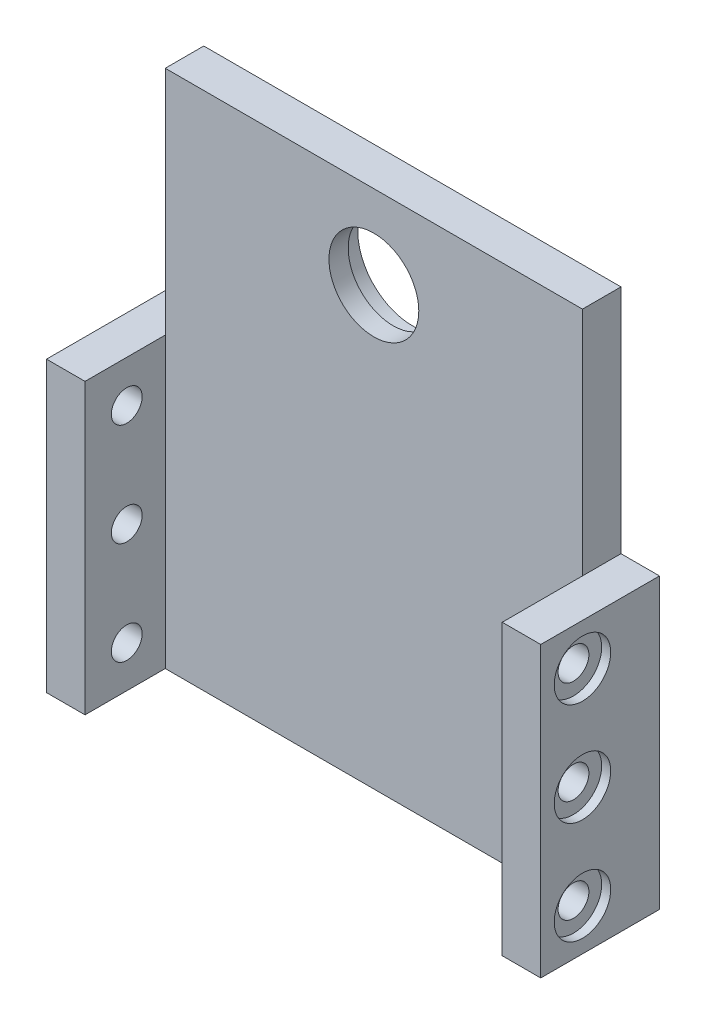
ISO-10303-21;
HEADER;
FILE_DESCRIPTION(('STEP AP214'),'2;1');
FILE_NAME('part.step','',(''),(''),'','','');
FILE_SCHEMA(('AUTOMOTIVE_DESIGN { 1 0 10303 214 1 1 1 1 }'));
ENDSEC;
DATA;
#1=APPLICATION_CONTEXT('core data for automotive mechanical design processes');
#2=APPLICATION_PROTOCOL_DEFINITION('international standard','automotive_design',2000,#1);
#3=PRODUCT_CONTEXT('',#1,'mechanical');
#4=PRODUCT('Part','Part','',(#3));
#5=PRODUCT_RELATED_PRODUCT_CATEGORY('part','',(#4));
#6=PRODUCT_DEFINITION_FORMATION('','',#4);
#7=PRODUCT_DEFINITION_CONTEXT('part definition',#1,'design');
#8=PRODUCT_DEFINITION('design','',#6,#7);
#9=PRODUCT_DEFINITION_SHAPE('','',#8);
#10=(LENGTH_UNIT() NAMED_UNIT(*) SI_UNIT(.MILLI.,.METRE.));
#11=(NAMED_UNIT(*) PLANE_ANGLE_UNIT() SI_UNIT($,.RADIAN.));
#12=(NAMED_UNIT(*) SI_UNIT($,.STERADIAN.) SOLID_ANGLE_UNIT());
#13=UNCERTAINTY_MEASURE_WITH_UNIT(LENGTH_MEASURE(1.E-05),#10,'distance_accuracy_value','');
#14=(GEOMETRIC_REPRESENTATION_CONTEXT(3) GLOBAL_UNCERTAINTY_ASSIGNED_CONTEXT((#13)) GLOBAL_UNIT_ASSIGNED_CONTEXT((#10,
#11,#12)) REPRESENTATION_CONTEXT('',''));
#15=CARTESIAN_POINT('',(0.,0.,0.));
#16=DIRECTION('',(0.,0.,1.));
#17=DIRECTION('',(1.,0.,0.));
#18=AXIS2_PLACEMENT_3D('',#15,#16,#17);
#19=CARTESIAN_POINT('',(16.25,-11.25,-3.));
#20=DIRECTION('',(1.,0.,0.));
#21=DIRECTION('',(0.,0.,-1.));
#22=AXIS2_PLACEMENT_3D('',#19,#20,#21);
#23=PLANE('',#22);
#24=DIRECTION('',(0.,1.,0.));
#25=VECTOR('',#24,1.);
#26=CARTESIAN_POINT('',(16.25,-11.25,0.));
#27=LINE('',#26,#25);
#28=CARTESIAN_POINT('',(16.25,11.25,0.));
#29=VERTEX_POINT('',#28);
#30=CARTESIAN_POINT('',(16.25,29.25,0.));
#31=VERTEX_POINT('',#30);
#32=EDGE_CURVE('E182',#29,#31,#27,.T.);
#33=ORIENTED_EDGE('',*,*,#32,.F.);
#34=DIRECTION('',(0.,0.,-1.));
#35=VECTOR('',#34,1.);
#36=CARTESIAN_POINT('',(16.25,11.25,-3.));
#37=LINE('',#36,#35);
#38=CARTESIAN_POINT('',(16.25,11.25,-3.));
#39=VERTEX_POINT('',#38);
#40=EDGE_CURVE('E12',#29,#39,#37,.T.);
#41=ORIENTED_EDGE('',*,*,#40,.T.);
#42=DIRECTION('',(0.,1.,0.));
#43=VECTOR('',#42,1.);
#44=CARTESIAN_POINT('',(16.25,-11.25,-3.));
#45=LINE('',#44,#43);
#46=CARTESIAN_POINT('',(16.25,29.25,-3.));
#47=VERTEX_POINT('',#46);
#48=EDGE_CURVE('E126',#39,#47,#45,.T.);
#49=ORIENTED_EDGE('',*,*,#48,.T.);
#50=DIRECTION('',(0.,0.,1.));
#51=VECTOR('',#50,1.);
#52=CARTESIAN_POINT('',(16.25,29.25,-3.));
#53=LINE('',#52,#51);
#54=EDGE_CURVE('E192',#47,#31,#53,.T.);
#55=ORIENTED_EDGE('',*,*,#54,.T.);
#56=EDGE_LOOP('',(#33,#41,#49,#55));
#57=FACE_BOUND('',#56,.T.);
#58=ADVANCED_FACE('F37',(#57),#23,.T.);
#59=CARTESIAN_POINT('',(16.25,-11.25,-3.));
#60=DIRECTION('',(0.,-1.,0.));
#61=DIRECTION('',(1.,0.,0.));
#62=AXIS2_PLACEMENT_3D('',#59,#60,#61);
#63=PLANE('',#62);
#64=DIRECTION('',(1.,0.,0.));
#65=VECTOR('',#64,1.);
#66=CARTESIAN_POINT('',(16.25,-11.25,0.));
#67=LINE('',#66,#65);
#68=CARTESIAN_POINT('',(-16.25,-11.25,0.));
#69=VERTEX_POINT('',#68);
#70=CARTESIAN_POINT('',(16.25,-11.25,0.));
#71=VERTEX_POINT('',#70);
#72=EDGE_CURVE('E185',#69,#71,#67,.T.);
#73=ORIENTED_EDGE('',*,*,#72,.F.);
#74=DIRECTION('',(0.,0.,1.));
#75=VECTOR('',#74,1.);
#76=CARTESIAN_POINT('',(-16.25,-11.25,-3.));
#77=LINE('',#76,#75);
#78=CARTESIAN_POINT('',(-16.25,-11.25,6.25000000000003));
#79=VERTEX_POINT('',#78);
#80=EDGE_CURVE('E127',#69,#79,#77,.T.);
#81=ORIENTED_EDGE('',*,*,#80,.T.);
#82=DIRECTION('',(1.,0.,0.));
#83=VECTOR('',#82,1.);
#84=CARTESIAN_POINT('',(-19.25,-11.25,6.25000000000003));
#85=LINE('',#84,#83);
#86=CARTESIAN_POINT('',(-19.25,-11.25,6.25000000000003));
#87=VERTEX_POINT('',#86);
#88=EDGE_CURVE('E179',#87,#79,#85,.T.);
#89=ORIENTED_EDGE('',*,*,#88,.F.);
#90=DIRECTION('',(0.,0.,1.));
#91=VECTOR('',#90,1.);
#92=CARTESIAN_POINT('',(-19.25,-11.25,-3.));
#93=LINE('',#92,#91);
#94=CARTESIAN_POINT('',(-19.25,-11.25,-3.));
#95=VERTEX_POINT('',#94);
#96=EDGE_CURVE('E161',#95,#87,#93,.T.);
#97=ORIENTED_EDGE('',*,*,#96,.F.);
#98=DIRECTION('',(1.,0.,0.));
#99=VECTOR('',#98,1.);
#100=CARTESIAN_POINT('',(16.25,-11.25,-3.));
#101=LINE('',#100,#99);
#102=CARTESIAN_POINT('',(19.25,-11.25,-3.));
#103=VERTEX_POINT('',#102);
#104=EDGE_CURVE('E190',#95,#103,#101,.T.);
#105=ORIENTED_EDGE('',*,*,#104,.T.);
#106=DIRECTION('',(0.,0.,1.));
#107=VECTOR('',#106,1.);
#108=CARTESIAN_POINT('',(19.25,-11.25,-3.));
#109=LINE('',#108,#107);
#110=CARTESIAN_POINT('',(19.25,-11.25,6.25000000000003));
#111=VERTEX_POINT('',#110);
#112=EDGE_CURVE('E137',#103,#111,#109,.T.);
#113=ORIENTED_EDGE('',*,*,#112,.T.);
#114=DIRECTION('',(-1.,0.,0.));
#115=VECTOR('',#114,1.);
#116=CARTESIAN_POINT('',(19.25,-11.25,6.25000000000003));
#117=LINE('',#116,#115);
#118=CARTESIAN_POINT('',(16.25,-11.25,6.25000000000003));
#119=VERTEX_POINT('',#118);
#120=EDGE_CURVE('E147',#111,#119,#117,.T.);
#121=ORIENTED_EDGE('',*,*,#120,.T.);
#122=DIRECTION('',(0.,0.,1.));
#123=VECTOR('',#122,1.);
#124=CARTESIAN_POINT('',(16.25,-11.25,-3.));
#125=LINE('',#124,#123);
#126=EDGE_CURVE('E138',#71,#119,#125,.T.);
#127=ORIENTED_EDGE('',*,*,#126,.F.);
#128=EDGE_LOOP('',(#73,#81,#89,#97,#105,#113,#121,#127));
#129=FACE_BOUND('',#128,.T.);
#130=ADVANCED_FACE('F220',(#129),#63,.T.);
#131=CARTESIAN_POINT('',(-16.25,-11.25,-3.));
#132=DIRECTION('',(-1.,0.,0.));
#133=DIRECTION('',(0.,0.,1.));
#134=AXIS2_PLACEMENT_3D('',#131,#132,#133);
#135=PLANE('',#134);
#136=DIRECTION('',(0.,0.,-1.));
#137=VECTOR('',#136,1.);
#138=CARTESIAN_POINT('',(-16.25,11.25,-3.));
#139=LINE('',#138,#137);
#140=CARTESIAN_POINT('',(-16.25,11.25,0.));
#141=VERTEX_POINT('',#140);
#142=CARTESIAN_POINT('',(-16.25,11.25,-3.));
#143=VERTEX_POINT('',#142);
#144=EDGE_CURVE('E45',#141,#143,#139,.T.);
#145=ORIENTED_EDGE('',*,*,#144,.F.);
#146=DIRECTION('',(0.,-1.,0.));
#147=VECTOR('',#146,1.);
#148=CARTESIAN_POINT('',(-16.25,-11.25,0.));
#149=LINE('',#148,#147);
#150=CARTESIAN_POINT('',(-16.25,29.25,0.));
#151=VERTEX_POINT('',#150);
#152=EDGE_CURVE('E200',#151,#141,#149,.T.);
#153=ORIENTED_EDGE('',*,*,#152,.F.);
#154=DIRECTION('',(0.,0.,1.));
#155=VECTOR('',#154,1.);
#156=CARTESIAN_POINT('',(-16.25,29.25,-3.));
#157=LINE('',#156,#155);
#158=CARTESIAN_POINT('',(-16.25,29.25,-3.));
#159=VERTEX_POINT('',#158);
#160=EDGE_CURVE('E204',#159,#151,#157,.T.);
#161=ORIENTED_EDGE('',*,*,#160,.F.);
#162=DIRECTION('',(0.,-1.,0.));
#163=VECTOR('',#162,1.);
#164=CARTESIAN_POINT('',(-16.25,-11.25,-3.));
#165=LINE('',#164,#163);
#166=EDGE_CURVE('E188',#159,#143,#165,.T.);
#167=ORIENTED_EDGE('',*,*,#166,.T.);
#168=EDGE_LOOP('',(#145,#153,#161,#167));
#169=FACE_BOUND('',#168,.T.);
#170=ADVANCED_FACE('F240',(#169),#135,.T.);
#171=CARTESIAN_POINT('',(16.25,29.25,-3.));
#172=DIRECTION('',(0.,1.,0.));
#173=DIRECTION('',(-1.,0.,0.));
#174=AXIS2_PLACEMENT_3D('',#171,#172,#173);
#175=PLANE('',#174);
#176=DIRECTION('',(-1.,0.,0.));
#177=VECTOR('',#176,1.);
#178=CARTESIAN_POINT('',(16.25,29.25,0.));
#179=LINE('',#178,#177);
#180=EDGE_CURVE('E196',#31,#151,#179,.T.);
#181=ORIENTED_EDGE('',*,*,#180,.F.);
#182=ORIENTED_EDGE('',*,*,#54,.F.);
#183=DIRECTION('',(-1.,0.,0.));
#184=VECTOR('',#183,1.);
#185=CARTESIAN_POINT('',(16.25,29.25,-3.));
#186=LINE('',#185,#184);
#187=EDGE_CURVE('E184',#47,#159,#186,.T.);
#188=ORIENTED_EDGE('',*,*,#187,.T.);
#189=ORIENTED_EDGE('',*,*,#160,.T.);
#190=EDGE_LOOP('',(#181,#182,#188,#189));
#191=FACE_BOUND('',#190,.T.);
#192=ADVANCED_FACE('F211',(#191),#175,.T.);
#193=CARTESIAN_POINT('',(0.,0.,-3.));
#194=DIRECTION('',(0.,0.,1.));
#195=DIRECTION('',(1.,0.,0.));
#196=AXIS2_PLACEMENT_3D('',#193,#194,#195);
#197=PLANE('',#196);
#198=CARTESIAN_POINT('',(0.,22.75,-3.));
#199=DIRECTION('',(0.,0.,-1.));
#200=DIRECTION('',(-1.,0.,0.));
#201=AXIS2_PLACEMENT_3D('',#198,#199,#200);
#202=CIRCLE('',#201,4.25);
#203=CARTESIAN_POINT('',(-4.25,22.75,-3.));
#204=VERTEX_POINT('',#203);
#205=EDGE_CURVE('E321',#204,#204,#202,.T.);
#206=ORIENTED_EDGE('',*,*,#205,.F.);
#207=EDGE_LOOP('',(#206));
#208=FACE_BOUND('',#207,.T.);
#209=ORIENTED_EDGE('',*,*,#48,.F.);
#210=DIRECTION('',(-1.,0.,0.));
#211=VECTOR('',#210,1.);
#212=CARTESIAN_POINT('',(19.25,11.25,-3.));
#213=LINE('',#212,#211);
#214=CARTESIAN_POINT('',(19.25,11.25,-3.));
#215=VERTEX_POINT('',#214);
#216=EDGE_CURVE('E54',#215,#39,#213,.T.);
#217=ORIENTED_EDGE('',*,*,#216,.F.);
#218=DIRECTION('',(0.,-1.,0.));
#219=VECTOR('',#218,1.);
#220=CARTESIAN_POINT('',(19.25,-11.25,-3.));
#221=LINE('',#220,#219);
#222=EDGE_CURVE('E123',#215,#103,#221,.T.);
#223=ORIENTED_EDGE('',*,*,#222,.T.);
#224=ORIENTED_EDGE('',*,*,#104,.F.);
#225=DIRECTION('',(0.,-1.,0.));
#226=VECTOR('',#225,1.);
#227=CARTESIAN_POINT('',(-19.25,-11.25,-3.));
#228=LINE('',#227,#226);
#229=CARTESIAN_POINT('',(-19.25,11.25,-3.));
#230=VERTEX_POINT('',#229);
#231=EDGE_CURVE('E158',#230,#95,#228,.T.);
#232=ORIENTED_EDGE('',*,*,#231,.F.);
#233=DIRECTION('',(1.,0.,0.));
#234=VECTOR('',#233,1.);
#235=CARTESIAN_POINT('',(-19.25,11.25,-3.));
#236=LINE('',#235,#234);
#237=EDGE_CURVE('E168',#230,#143,#236,.T.);
#238=ORIENTED_EDGE('',*,*,#237,.T.);
#239=ORIENTED_EDGE('',*,*,#166,.F.);
#240=ORIENTED_EDGE('',*,*,#187,.F.);
#241=EDGE_LOOP('',(#209,#217,#223,#224,#232,#238,#239,#240));
#242=FACE_BOUND('',#241,.T.);
#243=ADVANCED_FACE('F122',(#208,#242),#197,.F.);
#244=CARTESIAN_POINT('',(0.,0.,0.));
#245=DIRECTION('',(0.,0.,1.));
#246=DIRECTION('',(1.,0.,0.));
#247=AXIS2_PLACEMENT_3D('',#244,#245,#246);
#248=PLANE('',#247);
#249=CARTESIAN_POINT('',(0.,22.75,0.));
#250=DIRECTION('',(0.,0.,1.));
#251=DIRECTION('',(1.,0.,0.));
#252=AXIS2_PLACEMENT_3D('',#249,#250,#251);
#253=CIRCLE('',#252,3.50000000000001);
#254=CARTESIAN_POINT('',(3.50000000000003,22.75,0.));
#255=VERTEX_POINT('',#254);
#256=EDGE_CURVE('E318',#255,#255,#253,.T.);
#257=ORIENTED_EDGE('',*,*,#256,.F.);
#258=EDGE_LOOP('',(#257));
#259=FACE_BOUND('',#258,.T.);
#260=EDGE_CURVE('E193',#71,#29,#27,.T.);
#261=ORIENTED_EDGE('',*,*,#260,.T.);
#262=ORIENTED_EDGE('',*,*,#32,.T.);
#263=ORIENTED_EDGE('',*,*,#180,.T.);
#264=ORIENTED_EDGE('',*,*,#152,.T.);
#265=EDGE_CURVE('E199',#141,#69,#149,.T.);
#266=ORIENTED_EDGE('',*,*,#265,.T.);
#267=ORIENTED_EDGE('',*,*,#72,.T.);
#268=EDGE_LOOP('',(#261,#262,#263,#264,#266,#267));
#269=FACE_BOUND('',#268,.T.);
#270=ADVANCED_FACE('F213',(#259,#269),#248,.T.);
#271=CARTESIAN_POINT('',(-16.25,0.,0.));
#272=DIRECTION('',(1.,0.,0.));
#273=DIRECTION('',(0.,0.,-1.));
#274=AXIS2_PLACEMENT_3D('',#271,#272,#273);
#275=PLANE('',#274);
#276=CARTESIAN_POINT('',(-16.25,8.,3.00000000000002));
#277=DIRECTION('',(1.,0.,0.));
#278=DIRECTION('',(0.,0.,-1.));
#279=AXIS2_PLACEMENT_3D('',#276,#277,#278);
#280=CIRCLE('',#279,1.2);
#281=CARTESIAN_POINT('',(-16.25,8.,1.80000000000002));
#282=VERTEX_POINT('',#281);
#283=EDGE_CURVE('E461',#282,#282,#280,.T.);
#284=ORIENTED_EDGE('',*,*,#283,.F.);
#285=EDGE_LOOP('',(#284));
#286=FACE_BOUND('',#285,.T.);
#287=CARTESIAN_POINT('',(-16.25,0.,3.00000000000002));
#288=DIRECTION('',(1.,0.,0.));
#289=DIRECTION('',(0.,0.,-1.));
#290=AXIS2_PLACEMENT_3D('',#287,#288,#289);
#291=CIRCLE('',#290,1.2);
#292=CARTESIAN_POINT('',(-16.25,0.,1.80000000000002));
#293=VERTEX_POINT('',#292);
#294=EDGE_CURVE('E303',#293,#293,#291,.T.);
#295=ORIENTED_EDGE('',*,*,#294,.F.);
#296=EDGE_LOOP('',(#295));
#297=FACE_BOUND('',#296,.T.);
#298=CARTESIAN_POINT('',(-16.25,-8.,3.00000000000001));
#299=DIRECTION('',(1.,0.,0.));
#300=DIRECTION('',(0.,0.,-1.));
#301=AXIS2_PLACEMENT_3D('',#298,#299,#300);
#302=CIRCLE('',#301,1.2);
#303=CARTESIAN_POINT('',(-16.25,-8.,1.80000000000001));
#304=VERTEX_POINT('',#303);
#305=EDGE_CURVE('E315',#304,#304,#302,.T.);
#306=ORIENTED_EDGE('',*,*,#305,.F.);
#307=EDGE_LOOP('',(#306));
#308=FACE_BOUND('',#307,.T.);
#309=ORIENTED_EDGE('',*,*,#265,.F.);
#310=CARTESIAN_POINT('',(-16.25,11.25,6.25000000000003));
#311=VERTEX_POINT('',#310);
#312=EDGE_CURVE('E162',#311,#141,#139,.T.);
#313=ORIENTED_EDGE('',*,*,#312,.F.);
#314=DIRECTION('',(0.,1.,0.));
#315=VECTOR('',#314,1.);
#316=CARTESIAN_POINT('',(-16.25,-11.25,6.25000000000003));
#317=LINE('',#316,#315);
#318=EDGE_CURVE('E170',#79,#311,#317,.T.);
#319=ORIENTED_EDGE('',*,*,#318,.F.);
#320=ORIENTED_EDGE('',*,*,#80,.F.);
#321=EDGE_LOOP('',(#309,#313,#319,#320));
#322=FACE_BOUND('',#321,.T.);
#323=ADVANCED_FACE('F256',(#286,#297,#308,#322),#275,.T.);
#324=CARTESIAN_POINT('',(-19.25,-11.25,6.25000000000003));
#325=DIRECTION('',(0.,0.,-1.));
#326=DIRECTION('',(-1.,0.,0.));
#327=AXIS2_PLACEMENT_3D('',#324,#325,#326);
#328=PLANE('',#327);
#329=ORIENTED_EDGE('',*,*,#318,.T.);
#330=DIRECTION('',(1.,0.,0.));
#331=VECTOR('',#330,1.);
#332=CARTESIAN_POINT('',(-19.25,11.25,6.25000000000003));
#333=LINE('',#332,#331);
#334=CARTESIAN_POINT('',(-19.25,11.25,6.25000000000003));
#335=VERTEX_POINT('',#334);
#336=EDGE_CURVE('E176',#335,#311,#333,.T.);
#337=ORIENTED_EDGE('',*,*,#336,.F.);
#338=DIRECTION('',(0.,1.,0.));
#339=VECTOR('',#338,1.);
#340=CARTESIAN_POINT('',(-19.25,-11.25,6.25000000000003));
#341=LINE('',#340,#339);
#342=EDGE_CURVE('E164',#87,#335,#341,.T.);
#343=ORIENTED_EDGE('',*,*,#342,.F.);
#344=ORIENTED_EDGE('',*,*,#88,.T.);
#345=EDGE_LOOP('',(#329,#337,#343,#344));
#346=FACE_BOUND('',#345,.T.);
#347=ADVANCED_FACE('F260',(#346),#328,.F.);
#348=CARTESIAN_POINT('',(-19.25,11.25,-3.));
#349=DIRECTION('',(0.,-1.,0.));
#350=DIRECTION('',(0.,0.,-1.));
#351=AXIS2_PLACEMENT_3D('',#348,#349,#350);
#352=PLANE('',#351);
#353=ORIENTED_EDGE('',*,*,#312,.T.);
#354=ORIENTED_EDGE('',*,*,#144,.T.);
#355=ORIENTED_EDGE('',*,*,#237,.F.);
#356=DIRECTION('',(0.,0.,-1.));
#357=VECTOR('',#356,1.);
#358=CARTESIAN_POINT('',(-19.25,11.25,-3.));
#359=LINE('',#358,#357);
#360=EDGE_CURVE('E166',#335,#230,#359,.T.);
#361=ORIENTED_EDGE('',*,*,#360,.F.);
#362=ORIENTED_EDGE('',*,*,#336,.T.);
#363=EDGE_LOOP('',(#353,#354,#355,#361,#362));
#364=FACE_BOUND('',#363,.T.);
#365=ADVANCED_FACE('F263',(#364),#352,.F.);
#366=CARTESIAN_POINT('',(-19.25,0.,0.));
#367=DIRECTION('',(1.,0.,0.));
#368=DIRECTION('',(0.,0.,-1.));
#369=AXIS2_PLACEMENT_3D('',#366,#367,#368);
#370=PLANE('',#369);
#371=CARTESIAN_POINT('',(-19.25,8.,3.00000000000002));
#372=DIRECTION('',(-1.,0.,0.));
#373=DIRECTION('',(0.,0.,1.));
#374=AXIS2_PLACEMENT_3D('',#371,#372,#373);
#375=CIRCLE('',#374,2.19999999999999);
#376=CARTESIAN_POINT('',(-19.25,8.,5.20000000000002));
#377=VERTEX_POINT('',#376);
#378=EDGE_CURVE('E281',#377,#377,#375,.T.);
#379=ORIENTED_EDGE('',*,*,#378,.F.);
#380=EDGE_LOOP('',(#379));
#381=FACE_BOUND('',#380,.T.);
#382=CARTESIAN_POINT('',(-19.25,0.,3.00000000000002));
#383=DIRECTION('',(-1.,0.,0.));
#384=DIRECTION('',(0.,0.,1.));
#385=AXIS2_PLACEMENT_3D('',#382,#383,#384);
#386=CIRCLE('',#385,2.19999999999999);
#387=CARTESIAN_POINT('',(-19.25,0.,5.20000000000001));
#388=VERTEX_POINT('',#387);
#389=EDGE_CURVE('E285',#388,#388,#386,.T.);
#390=ORIENTED_EDGE('',*,*,#389,.F.);
#391=EDGE_LOOP('',(#390));
#392=FACE_BOUND('',#391,.T.);
#393=CARTESIAN_POINT('',(-19.25,-8.,3.00000000000001));
#394=DIRECTION('',(-1.,0.,0.));
#395=DIRECTION('',(0.,0.,1.));
#396=AXIS2_PLACEMENT_3D('',#393,#394,#395);
#397=CIRCLE('',#396,2.19999999999999);
#398=CARTESIAN_POINT('',(-19.25,-8.,5.20000000000001));
#399=VERTEX_POINT('',#398);
#400=EDGE_CURVE('E289',#399,#399,#397,.T.);
#401=ORIENTED_EDGE('',*,*,#400,.F.);
#402=EDGE_LOOP('',(#401));
#403=FACE_BOUND('',#402,.T.);
#404=ORIENTED_EDGE('',*,*,#231,.T.);
#405=ORIENTED_EDGE('',*,*,#96,.T.);
#406=ORIENTED_EDGE('',*,*,#342,.T.);
#407=ORIENTED_EDGE('',*,*,#360,.T.);
#408=EDGE_LOOP('',(#404,#405,#406,#407));
#409=FACE_BOUND('',#408,.T.);
#410=ADVANCED_FACE('F267',(#381,#392,#403,#409),#370,.F.);
#411=CARTESIAN_POINT('',(16.25,0.,0.));
#412=DIRECTION('',(-1.,0.,0.));
#413=DIRECTION('',(0.,0.,-1.));
#414=AXIS2_PLACEMENT_3D('',#411,#412,#413);
#415=PLANE('',#414);
#416=CARTESIAN_POINT('',(16.25,8.,3.00000000000002));
#417=DIRECTION('',(-1.,0.,0.));
#418=DIRECTION('',(0.,0.,1.));
#419=AXIS2_PLACEMENT_3D('',#416,#417,#418);
#420=CIRCLE('',#419,1.2);
#421=CARTESIAN_POINT('',(16.25,8.,4.20000000000002));
#422=VERTEX_POINT('',#421);
#423=EDGE_CURVE('E427',#422,#422,#420,.T.);
#424=ORIENTED_EDGE('',*,*,#423,.F.);
#425=EDGE_LOOP('',(#424));
#426=FACE_BOUND('',#425,.T.);
#427=CARTESIAN_POINT('',(16.25,0.,3.00000000000002));
#428=DIRECTION('',(-1.,0.,0.));
#429=DIRECTION('',(0.,0.,1.));
#430=AXIS2_PLACEMENT_3D('',#427,#428,#429);
#431=CIRCLE('',#430,1.2);
#432=CARTESIAN_POINT('',(16.25,0.,4.20000000000002));
#433=VERTEX_POINT('',#432);
#434=EDGE_CURVE('E439',#433,#433,#431,.T.);
#435=ORIENTED_EDGE('',*,*,#434,.F.);
#436=EDGE_LOOP('',(#435));
#437=FACE_BOUND('',#436,.T.);
#438=CARTESIAN_POINT('',(16.25,-8.,3.00000000000001));
#439=DIRECTION('',(-1.,0.,0.));
#440=DIRECTION('',(0.,0.,1.));
#441=AXIS2_PLACEMENT_3D('',#438,#439,#440);
#442=CIRCLE('',#441,1.2);
#443=CARTESIAN_POINT('',(16.25,-8.,4.20000000000001));
#444=VERTEX_POINT('',#443);
#445=EDGE_CURVE('E451',#444,#444,#442,.T.);
#446=ORIENTED_EDGE('',*,*,#445,.F.);
#447=EDGE_LOOP('',(#446));
#448=FACE_BOUND('',#447,.T.);
#449=ORIENTED_EDGE('',*,*,#260,.F.);
#450=ORIENTED_EDGE('',*,*,#126,.T.);
#451=DIRECTION('',(0.,1.,0.));
#452=VECTOR('',#451,1.);
#453=CARTESIAN_POINT('',(16.25,-11.25,6.25000000000003));
#454=LINE('',#453,#452);
#455=CARTESIAN_POINT('',(16.25,11.25,6.25000000000003));
#456=VERTEX_POINT('',#455);
#457=EDGE_CURVE('E150',#119,#456,#454,.T.);
#458=ORIENTED_EDGE('',*,*,#457,.T.);
#459=EDGE_CURVE('E47',#456,#29,#37,.T.);
#460=ORIENTED_EDGE('',*,*,#459,.T.);
#461=EDGE_LOOP('',(#449,#450,#458,#460));
#462=FACE_BOUND('',#461,.T.);
#463=ADVANCED_FACE('F218',(#426,#437,#448,#462),#415,.T.);
#464=CARTESIAN_POINT('',(19.25,11.25,-3.));
#465=DIRECTION('',(0.,1.,0.));
#466=DIRECTION('',(0.,0.,1.));
#467=AXIS2_PLACEMENT_3D('',#464,#465,#466);
#468=PLANE('',#467);
#469=ORIENTED_EDGE('',*,*,#459,.F.);
#470=DIRECTION('',(-1.,0.,0.));
#471=VECTOR('',#470,1.);
#472=CARTESIAN_POINT('',(19.25,11.25,6.25000000000003));
#473=LINE('',#472,#471);
#474=CARTESIAN_POINT('',(19.25,11.25,6.25000000000003));
#475=VERTEX_POINT('',#474);
#476=EDGE_CURVE('E128',#475,#456,#473,.T.);
#477=ORIENTED_EDGE('',*,*,#476,.F.);
#478=DIRECTION('',(0.,0.,-1.));
#479=VECTOR('',#478,1.);
#480=CARTESIAN_POINT('',(19.25,11.25,-3.));
#481=LINE('',#480,#479);
#482=EDGE_CURVE('E134',#475,#215,#481,.T.);
#483=ORIENTED_EDGE('',*,*,#482,.T.);
#484=ORIENTED_EDGE('',*,*,#216,.T.);
#485=ORIENTED_EDGE('',*,*,#40,.F.);
#486=EDGE_LOOP('',(#469,#477,#483,#484,#485));
#487=FACE_BOUND('',#486,.T.);
#488=ADVANCED_FACE('F141',(#487),#468,.T.);
#489=CARTESIAN_POINT('',(19.25,-11.25,6.25000000000003));
#490=DIRECTION('',(0.,0.,1.));
#491=DIRECTION('',(1.,0.,0.));
#492=AXIS2_PLACEMENT_3D('',#489,#490,#491);
#493=PLANE('',#492);
#494=ORIENTED_EDGE('',*,*,#457,.F.);
#495=ORIENTED_EDGE('',*,*,#120,.F.);
#496=DIRECTION('',(0.,1.,0.));
#497=VECTOR('',#496,1.);
#498=CARTESIAN_POINT('',(19.25,-11.25,6.25000000000003));
#499=LINE('',#498,#497);
#500=EDGE_CURVE('E142',#111,#475,#499,.T.);
#501=ORIENTED_EDGE('',*,*,#500,.T.);
#502=ORIENTED_EDGE('',*,*,#476,.T.);
#503=EDGE_LOOP('',(#494,#495,#501,#502));
#504=FACE_BOUND('',#503,.T.);
#505=ADVANCED_FACE('F224',(#504),#493,.T.);
#506=CARTESIAN_POINT('',(19.25,0.,0.));
#507=DIRECTION('',(-1.,0.,0.));
#508=DIRECTION('',(0.,0.,-1.));
#509=AXIS2_PLACEMENT_3D('',#506,#507,#508);
#510=PLANE('',#509);
#511=CARTESIAN_POINT('',(19.25,8.,3.00000000000002));
#512=DIRECTION('',(1.,0.,0.));
#513=DIRECTION('',(0.,0.,-1.));
#514=AXIS2_PLACEMENT_3D('',#511,#512,#513);
#515=CIRCLE('',#514,2.19999999999999);
#516=CARTESIAN_POINT('',(19.25,8.,0.80000000000003));
#517=VERTEX_POINT('',#516);
#518=EDGE_CURVE('E420',#517,#517,#515,.T.);
#519=ORIENTED_EDGE('',*,*,#518,.F.);
#520=EDGE_LOOP('',(#519));
#521=FACE_BOUND('',#520,.T.);
#522=CARTESIAN_POINT('',(19.25,0.,3.00000000000002));
#523=DIRECTION('',(1.,0.,0.));
#524=DIRECTION('',(0.,0.,-1.));
#525=AXIS2_PLACEMENT_3D('',#522,#523,#524);
#526=CIRCLE('',#525,2.19999999999999);
#527=CARTESIAN_POINT('',(19.25,0.,0.800000000000023));
#528=VERTEX_POINT('',#527);
#529=EDGE_CURVE('E430',#528,#528,#526,.T.);
#530=ORIENTED_EDGE('',*,*,#529,.F.);
#531=EDGE_LOOP('',(#530));
#532=FACE_BOUND('',#531,.T.);
#533=CARTESIAN_POINT('',(19.25,-8.,3.00000000000001));
#534=DIRECTION('',(1.,0.,0.));
#535=DIRECTION('',(0.,0.,-1.));
#536=AXIS2_PLACEMENT_3D('',#533,#534,#535);
#537=CIRCLE('',#536,2.19999999999999);
#538=CARTESIAN_POINT('',(19.25,-8.,0.800000000000019));
#539=VERTEX_POINT('',#538);
#540=EDGE_CURVE('E442',#539,#539,#537,.T.);
#541=ORIENTED_EDGE('',*,*,#540,.F.);
#542=EDGE_LOOP('',(#541));
#543=FACE_BOUND('',#542,.T.);
#544=ORIENTED_EDGE('',*,*,#222,.F.);
#545=ORIENTED_EDGE('',*,*,#482,.F.);
#546=ORIENTED_EDGE('',*,*,#500,.F.);
#547=ORIENTED_EDGE('',*,*,#112,.F.);
#548=EDGE_LOOP('',(#544,#545,#546,#547));
#549=FACE_BOUND('',#548,.T.);
#550=ADVANCED_FACE('F132',(#521,#532,#543,#549),#510,.F.);
#551=CARTESIAN_POINT('',(0.,0.,-1.5));
#552=DIRECTION('',(0.,0.,1.));
#553=DIRECTION('',(1.,0.,0.));
#554=AXIS2_PLACEMENT_3D('',#551,#552,#553);
#555=PLANE('',#554);
#556=CARTESIAN_POINT('',(0.,22.75,-1.5));
#557=DIRECTION('',(0.,0.,1.));
#558=DIRECTION('',(1.,0.,0.));
#559=AXIS2_PLACEMENT_3D('',#556,#557,#558);
#560=CIRCLE('',#559,3.50000000000001);
#561=CARTESIAN_POINT('',(3.50000000000003,22.75,-1.5));
#562=VERTEX_POINT('',#561);
#563=EDGE_CURVE('E40',#562,#562,#560,.T.);
#564=ORIENTED_EDGE('',*,*,#563,.T.);
#565=EDGE_LOOP('',(#564));
#566=FACE_BOUND('',#565,.T.);
#567=CARTESIAN_POINT('',(0.,22.75,-1.5));
#568=DIRECTION('',(0.,0.,1.));
#569=DIRECTION('',(1.,0.,0.));
#570=AXIS2_PLACEMENT_3D('',#567,#568,#569);
#571=CIRCLE('',#570,4.25);
#572=CARTESIAN_POINT('',(4.25,22.75,-1.5));
#573=VERTEX_POINT('',#572);
#574=EDGE_CURVE('E151',#573,#573,#571,.F.);
#575=ORIENTED_EDGE('',*,*,#574,.T.);
#576=EDGE_LOOP('',(#575));
#577=FACE_BOUND('',#576,.T.);
#578=ADVANCED_FACE('F231',(#566,#577),#555,.F.);
#579=CARTESIAN_POINT('',(0.,22.75,12.0208152801713));
#580=DIRECTION('',(0.,0.,-1.));
#581=DIRECTION('',(-1.,0.,0.));
#582=AXIS2_PLACEMENT_3D('',#579,#580,#581);
#583=CYLINDRICAL_SURFACE('',#582,4.25);
#584=ORIENTED_EDGE('',*,*,#205,.T.);
#585=EDGE_LOOP('',(#584));
#586=FACE_BOUND('',#585,.T.);
#587=ORIENTED_EDGE('',*,*,#574,.F.);
#588=EDGE_LOOP('',(#587));
#589=FACE_BOUND('',#588,.T.);
#590=ADVANCED_FACE('F327',(#586,#589),#583,.F.);
#591=CARTESIAN_POINT('',(0.,22.75,6.25000000000003));
#592=DIRECTION('',(0.,0.,-1.));
#593=DIRECTION('',(-1.,0.,0.));
#594=AXIS2_PLACEMENT_3D('',#591,#592,#593);
#595=CYLINDRICAL_SURFACE('',#594,3.50000000000001);
#596=ORIENTED_EDGE('',*,*,#256,.T.);
#597=EDGE_LOOP('',(#596));
#598=FACE_BOUND('',#597,.T.);
#599=ORIENTED_EDGE('',*,*,#563,.F.);
#600=EDGE_LOOP('',(#599));
#601=FACE_BOUND('',#600,.T.);
#602=ADVANCED_FACE('F329',(#598,#601),#595,.F.);
#603=CARTESIAN_POINT('',(-19.25,-8.,3.00000000000001));
#604=DIRECTION('',(-1.,0.,0.));
#605=DIRECTION('',(0.,0.,1.));
#606=AXIS2_PLACEMENT_3D('',#603,#604,#605);
#607=CYLINDRICAL_SURFACE('',#606,1.2);
#608=CARTESIAN_POINT('',(-18.55,-8.,3.00000000000001));
#609=DIRECTION('',(-1.,0.,0.));
#610=DIRECTION('',(0.,0.,1.));
#611=AXIS2_PLACEMENT_3D('',#608,#609,#610);
#612=CIRCLE('',#611,1.2);
#613=CARTESIAN_POINT('',(-18.55,-8.,4.20000000000001));
#614=VERTEX_POINT('',#613);
#615=EDGE_CURVE('E306',#614,#614,#612,.T.);
#616=ORIENTED_EDGE('',*,*,#615,.T.);
#617=EDGE_LOOP('',(#616));
#618=FACE_BOUND('',#617,.T.);
#619=ORIENTED_EDGE('',*,*,#305,.T.);
#620=EDGE_LOOP('',(#619));
#621=FACE_BOUND('',#620,.T.);
#622=ADVANCED_FACE('F336',(#618,#621),#607,.F.);
#623=CARTESIAN_POINT('',(-18.55,-6.8,3.00000000000001));
#624=DIRECTION('',(1.,0.,0.));
#625=DIRECTION('',(0.,0.,-1.));
#626=AXIS2_PLACEMENT_3D('',#623,#624,#625);
#627=PLANE('',#626);
#628=ORIENTED_EDGE('',*,*,#615,.F.);
#629=EDGE_LOOP('',(#628));
#630=FACE_BOUND('',#629,.T.);
#631=CARTESIAN_POINT('',(-18.55,-8.,3.00000000000001));
#632=DIRECTION('',(-1.,0.,0.));
#633=DIRECTION('',(0.,0.,1.));
#634=AXIS2_PLACEMENT_3D('',#631,#632,#633);
#635=CIRCLE('',#634,2.2);
#636=CARTESIAN_POINT('',(-18.55,-8.,5.20000000000001));
#637=VERTEX_POINT('',#636);
#638=EDGE_CURVE('E302',#637,#637,#635,.T.);
#639=ORIENTED_EDGE('',*,*,#638,.T.);
#640=EDGE_LOOP('',(#639));
#641=FACE_BOUND('',#640,.T.);
#642=ADVANCED_FACE('F344',(#630,#641),#627,.F.);
#643=CARTESIAN_POINT('',(-19.25,-8.,3.00000000000001));
#644=DIRECTION('',(-1.,0.,0.));
#645=DIRECTION('',(0.,0.,1.));
#646=AXIS2_PLACEMENT_3D('',#643,#644,#645);
#647=CYLINDRICAL_SURFACE('',#646,2.2);
#648=ORIENTED_EDGE('',*,*,#638,.F.);
#649=EDGE_LOOP('',(#648));
#650=FACE_BOUND('',#649,.T.);
#651=ORIENTED_EDGE('',*,*,#400,.T.);
#652=EDGE_LOOP('',(#651));
#653=FACE_BOUND('',#652,.T.);
#654=ADVANCED_FACE('F348',(#650,#653),#647,.F.);
#655=CARTESIAN_POINT('',(-19.25,0.,3.00000000000002));
#656=DIRECTION('',(-1.,0.,0.));
#657=DIRECTION('',(0.,0.,1.));
#658=AXIS2_PLACEMENT_3D('',#655,#656,#657);
#659=CYLINDRICAL_SURFACE('',#658,1.2);
#660=CARTESIAN_POINT('',(-18.55,0.,3.00000000000002));
#661=DIRECTION('',(-1.,0.,0.));
#662=DIRECTION('',(0.,0.,1.));
#663=AXIS2_PLACEMENT_3D('',#660,#661,#662);
#664=CIRCLE('',#663,1.2);
#665=CARTESIAN_POINT('',(-18.55,0.,4.20000000000002));
#666=VERTEX_POINT('',#665);
#667=EDGE_CURVE('E309',#666,#666,#664,.T.);
#668=ORIENTED_EDGE('',*,*,#667,.T.);
#669=EDGE_LOOP('',(#668));
#670=FACE_BOUND('',#669,.T.);
#671=ORIENTED_EDGE('',*,*,#294,.T.);
#672=EDGE_LOOP('',(#671));
#673=FACE_BOUND('',#672,.T.);
#674=ADVANCED_FACE('F352',(#670,#673),#659,.F.);
#675=CARTESIAN_POINT('',(-18.55,1.2,3.00000000000002));
#676=DIRECTION('',(1.,0.,0.));
#677=DIRECTION('',(0.,0.,-1.));
#678=AXIS2_PLACEMENT_3D('',#675,#676,#677);
#679=PLANE('',#678);
#680=ORIENTED_EDGE('',*,*,#667,.F.);
#681=EDGE_LOOP('',(#680));
#682=FACE_BOUND('',#681,.T.);
#683=CARTESIAN_POINT('',(-18.55,0.,3.00000000000002));
#684=DIRECTION('',(-1.,0.,0.));
#685=DIRECTION('',(0.,0.,1.));
#686=AXIS2_PLACEMENT_3D('',#683,#684,#685);
#687=CIRCLE('',#686,2.2);
#688=CARTESIAN_POINT('',(-18.55,0.,5.20000000000002));
#689=VERTEX_POINT('',#688);
#690=EDGE_CURVE('E465',#689,#689,#687,.T.);
#691=ORIENTED_EDGE('',*,*,#690,.T.);
#692=EDGE_LOOP('',(#691));
#693=FACE_BOUND('',#692,.T.);
#694=ADVANCED_FACE('F356',(#682,#693),#679,.F.);
#695=CARTESIAN_POINT('',(-19.25,0.,3.00000000000002));
#696=DIRECTION('',(-1.,0.,0.));
#697=DIRECTION('',(0.,0.,1.));
#698=AXIS2_PLACEMENT_3D('',#695,#696,#697);
#699=CYLINDRICAL_SURFACE('',#698,2.2);
#700=ORIENTED_EDGE('',*,*,#690,.F.);
#701=EDGE_LOOP('',(#700));
#702=FACE_BOUND('',#701,.T.);
#703=ORIENTED_EDGE('',*,*,#389,.T.);
#704=EDGE_LOOP('',(#703));
#705=FACE_BOUND('',#704,.T.);
#706=ADVANCED_FACE('F360',(#702,#705),#699,.F.);
#707=CARTESIAN_POINT('',(-19.25,8.,3.00000000000002));
#708=DIRECTION('',(-1.,0.,0.));
#709=DIRECTION('',(0.,0.,1.));
#710=AXIS2_PLACEMENT_3D('',#707,#708,#709);
#711=CYLINDRICAL_SURFACE('',#710,1.2);
#712=CARTESIAN_POINT('',(-18.55,8.,3.00000000000002));
#713=DIRECTION('',(-1.,0.,0.));
#714=DIRECTION('',(0.,0.,1.));
#715=AXIS2_PLACEMENT_3D('',#712,#713,#714);
#716=CIRCLE('',#715,1.2);
#717=CARTESIAN_POINT('',(-18.55,8.,4.20000000000002));
#718=VERTEX_POINT('',#717);
#719=EDGE_CURVE('E458',#718,#718,#716,.T.);
#720=ORIENTED_EDGE('',*,*,#719,.T.);
#721=EDGE_LOOP('',(#720));
#722=FACE_BOUND('',#721,.T.);
#723=ORIENTED_EDGE('',*,*,#283,.T.);
#724=EDGE_LOOP('',(#723));
#725=FACE_BOUND('',#724,.T.);
#726=ADVANCED_FACE('F364',(#722,#725),#711,.F.);
#727=CARTESIAN_POINT('',(-18.55,9.2,3.00000000000002));
#728=DIRECTION('',(1.,0.,0.));
#729=DIRECTION('',(0.,0.,-1.));
#730=AXIS2_PLACEMENT_3D('',#727,#728,#729);
#731=PLANE('',#730);
#732=ORIENTED_EDGE('',*,*,#719,.F.);
#733=EDGE_LOOP('',(#732));
#734=FACE_BOUND('',#733,.T.);
#735=CARTESIAN_POINT('',(-18.55,8.,3.00000000000002));
#736=DIRECTION('',(-1.,0.,0.));
#737=DIRECTION('',(0.,0.,1.));
#738=AXIS2_PLACEMENT_3D('',#735,#736,#737);
#739=CIRCLE('',#738,2.2);
#740=CARTESIAN_POINT('',(-18.55,8.,5.20000000000002));
#741=VERTEX_POINT('',#740);
#742=EDGE_CURVE('E455',#741,#741,#739,.T.);
#743=ORIENTED_EDGE('',*,*,#742,.T.);
#744=EDGE_LOOP('',(#743));
#745=FACE_BOUND('',#744,.T.);
#746=ADVANCED_FACE('F368',(#734,#745),#731,.F.);
#747=CARTESIAN_POINT('',(-19.25,8.,3.00000000000002));
#748=DIRECTION('',(-1.,0.,0.));
#749=DIRECTION('',(0.,0.,1.));
#750=AXIS2_PLACEMENT_3D('',#747,#748,#749);
#751=CYLINDRICAL_SURFACE('',#750,2.2);
#752=ORIENTED_EDGE('',*,*,#742,.F.);
#753=EDGE_LOOP('',(#752));
#754=FACE_BOUND('',#753,.T.);
#755=ORIENTED_EDGE('',*,*,#378,.T.);
#756=EDGE_LOOP('',(#755));
#757=FACE_BOUND('',#756,.T.);
#758=ADVANCED_FACE('F372',(#754,#757),#751,.F.);
#759=CARTESIAN_POINT('',(19.25,-8.,3.00000000000001));
#760=DIRECTION('',(1.,0.,0.));
#761=DIRECTION('',(0.,0.,-1.));
#762=AXIS2_PLACEMENT_3D('',#759,#760,#761);
#763=CYLINDRICAL_SURFACE('',#762,1.2);
#764=CARTESIAN_POINT('',(18.55,-8.,3.00000000000001));
#765=DIRECTION('',(1.,0.,0.));
#766=DIRECTION('',(0.,0.,-1.));
#767=AXIS2_PLACEMENT_3D('',#764,#765,#766);
#768=CIRCLE('',#767,1.2);
#769=CARTESIAN_POINT('',(18.55,-8.,1.80000000000001));
#770=VERTEX_POINT('',#769);
#771=EDGE_CURVE('E448',#770,#770,#768,.T.);
#772=ORIENTED_EDGE('',*,*,#771,.T.);
#773=EDGE_LOOP('',(#772));
#774=FACE_BOUND('',#773,.T.);
#775=ORIENTED_EDGE('',*,*,#445,.T.);
#776=EDGE_LOOP('',(#775));
#777=FACE_BOUND('',#776,.T.);
#778=ADVANCED_FACE('F376',(#774,#777),#763,.F.);
#779=CARTESIAN_POINT('',(18.55,-6.8,3.00000000000001));
#780=DIRECTION('',(-1.,0.,0.));
#781=DIRECTION('',(0.,0.,1.));
#782=AXIS2_PLACEMENT_3D('',#779,#780,#781);
#783=PLANE('',#782);
#784=ORIENTED_EDGE('',*,*,#771,.F.);
#785=EDGE_LOOP('',(#784));
#786=FACE_BOUND('',#785,.T.);
#787=CARTESIAN_POINT('',(18.55,-8.,3.00000000000001));
#788=DIRECTION('',(1.,0.,0.));
#789=DIRECTION('',(0.,0.,-1.));
#790=AXIS2_PLACEMENT_3D('',#787,#788,#789);
#791=CIRCLE('',#790,2.2);
#792=CARTESIAN_POINT('',(18.55,-8.,0.800000000000012));
#793=VERTEX_POINT('',#792);
#794=EDGE_CURVE('E445',#793,#793,#791,.T.);
#795=ORIENTED_EDGE('',*,*,#794,.T.);
#796=EDGE_LOOP('',(#795));
#797=FACE_BOUND('',#796,.T.);
#798=ADVANCED_FACE('F380',(#786,#797),#783,.F.);
#799=CARTESIAN_POINT('',(19.25,-8.,3.00000000000001));
#800=DIRECTION('',(1.,0.,0.));
#801=DIRECTION('',(0.,0.,-1.));
#802=AXIS2_PLACEMENT_3D('',#799,#800,#801);
#803=CYLINDRICAL_SURFACE('',#802,2.2);
#804=ORIENTED_EDGE('',*,*,#794,.F.);
#805=EDGE_LOOP('',(#804));
#806=FACE_BOUND('',#805,.T.);
#807=ORIENTED_EDGE('',*,*,#540,.T.);
#808=EDGE_LOOP('',(#807));
#809=FACE_BOUND('',#808,.T.);
#810=ADVANCED_FACE('F384',(#806,#809),#803,.F.);
#811=CARTESIAN_POINT('',(19.25,0.,3.00000000000002));
#812=DIRECTION('',(1.,0.,0.));
#813=DIRECTION('',(0.,0.,-1.));
#814=AXIS2_PLACEMENT_3D('',#811,#812,#813);
#815=CYLINDRICAL_SURFACE('',#814,1.2);
#816=CARTESIAN_POINT('',(18.55,0.,3.00000000000002));
#817=DIRECTION('',(1.,0.,0.));
#818=DIRECTION('',(0.,0.,-1.));
#819=AXIS2_PLACEMENT_3D('',#816,#817,#818);
#820=CIRCLE('',#819,1.2);
#821=CARTESIAN_POINT('',(18.55,0.,1.80000000000002));
#822=VERTEX_POINT('',#821);
#823=EDGE_CURVE('E436',#822,#822,#820,.T.);
#824=ORIENTED_EDGE('',*,*,#823,.T.);
#825=EDGE_LOOP('',(#824));
#826=FACE_BOUND('',#825,.T.);
#827=ORIENTED_EDGE('',*,*,#434,.T.);
#828=EDGE_LOOP('',(#827));
#829=FACE_BOUND('',#828,.T.);
#830=ADVANCED_FACE('F388',(#826,#829),#815,.F.);
#831=CARTESIAN_POINT('',(18.55,1.2,3.00000000000002));
#832=DIRECTION('',(-1.,0.,0.));
#833=DIRECTION('',(0.,0.,1.));
#834=AXIS2_PLACEMENT_3D('',#831,#832,#833);
#835=PLANE('',#834);
#836=ORIENTED_EDGE('',*,*,#823,.F.);
#837=EDGE_LOOP('',(#836));
#838=FACE_BOUND('',#837,.T.);
#839=CARTESIAN_POINT('',(18.55,0.,3.00000000000002));
#840=DIRECTION('',(1.,0.,0.));
#841=DIRECTION('',(0.,0.,-1.));
#842=AXIS2_PLACEMENT_3D('',#839,#840,#841);
#843=CIRCLE('',#842,2.2);
#844=CARTESIAN_POINT('',(18.55,0.,0.800000000000016));
#845=VERTEX_POINT('',#844);
#846=EDGE_CURVE('E433',#845,#845,#843,.T.);
#847=ORIENTED_EDGE('',*,*,#846,.T.);
#848=EDGE_LOOP('',(#847));
#849=FACE_BOUND('',#848,.T.);
#850=ADVANCED_FACE('F392',(#838,#849),#835,.F.);
#851=CARTESIAN_POINT('',(19.25,0.,3.00000000000002));
#852=DIRECTION('',(1.,0.,0.));
#853=DIRECTION('',(0.,0.,-1.));
#854=AXIS2_PLACEMENT_3D('',#851,#852,#853);
#855=CYLINDRICAL_SURFACE('',#854,2.2);
#856=ORIENTED_EDGE('',*,*,#846,.F.);
#857=EDGE_LOOP('',(#856));
#858=FACE_BOUND('',#857,.T.);
#859=ORIENTED_EDGE('',*,*,#529,.T.);
#860=EDGE_LOOP('',(#859));
#861=FACE_BOUND('',#860,.T.);
#862=ADVANCED_FACE('F396',(#858,#861),#855,.F.);
#863=CARTESIAN_POINT('',(19.25,8.,3.00000000000002));
#864=DIRECTION('',(1.,0.,0.));
#865=DIRECTION('',(0.,0.,-1.));
#866=AXIS2_PLACEMENT_3D('',#863,#864,#865);
#867=CYLINDRICAL_SURFACE('',#866,1.2);
#868=CARTESIAN_POINT('',(18.55,8.,3.00000000000002));
#869=DIRECTION('',(1.,0.,0.));
#870=DIRECTION('',(0.,0.,-1.));
#871=AXIS2_PLACEMENT_3D('',#868,#869,#870);
#872=CIRCLE('',#871,1.2);
#873=CARTESIAN_POINT('',(18.55,8.,1.80000000000002));
#874=VERTEX_POINT('',#873);
#875=EDGE_CURVE('E422',#874,#874,#872,.T.);
#876=ORIENTED_EDGE('',*,*,#875,.T.);
#877=EDGE_LOOP('',(#876));
#878=FACE_BOUND('',#877,.T.);
#879=ORIENTED_EDGE('',*,*,#423,.T.);
#880=EDGE_LOOP('',(#879));
#881=FACE_BOUND('',#880,.T.);
#882=ADVANCED_FACE('F400',(#878,#881),#867,.F.);
#883=CARTESIAN_POINT('',(18.55,9.2,3.00000000000002));
#884=DIRECTION('',(-1.,0.,0.));
#885=DIRECTION('',(0.,0.,1.));
#886=AXIS2_PLACEMENT_3D('',#883,#884,#885);
#887=PLANE('',#886);
#888=ORIENTED_EDGE('',*,*,#875,.F.);
#889=EDGE_LOOP('',(#888));
#890=FACE_BOUND('',#889,.T.);
#891=CARTESIAN_POINT('',(18.55,8.,3.00000000000002));
#892=DIRECTION('',(1.,0.,0.));
#893=DIRECTION('',(0.,0.,-1.));
#894=AXIS2_PLACEMENT_3D('',#891,#892,#893);
#895=CIRCLE('',#894,2.2);
#896=CARTESIAN_POINT('',(18.55,8.,0.800000000000023));
#897=VERTEX_POINT('',#896);
#898=EDGE_CURVE('E417',#897,#897,#895,.T.);
#899=ORIENTED_EDGE('',*,*,#898,.T.);
#900=EDGE_LOOP('',(#899));
#901=FACE_BOUND('',#900,.T.);
#902=ADVANCED_FACE('F404',(#890,#901),#887,.F.);
#903=CARTESIAN_POINT('',(19.25,8.,3.00000000000002));
#904=DIRECTION('',(1.,0.,0.));
#905=DIRECTION('',(0.,0.,-1.));
#906=AXIS2_PLACEMENT_3D('',#903,#904,#905);
#907=CYLINDRICAL_SURFACE('',#906,2.2);
#908=ORIENTED_EDGE('',*,*,#898,.F.);
#909=EDGE_LOOP('',(#908));
#910=FACE_BOUND('',#909,.T.);
#911=ORIENTED_EDGE('',*,*,#518,.T.);
#912=EDGE_LOOP('',(#911));
#913=FACE_BOUND('',#912,.T.);
#914=ADVANCED_FACE('F408',(#910,#913),#907,.F.);
#915=CLOSED_SHELL('',(#58,#130,#170,#192,#243,#270,#323,#347,#365,#410,#463,#488,#505,#550,#578,
#590,#602,#622,#642,#654,#674,#694,#706,#726,#746,#758,#778,#798,#810,#830,#850,#862,#882,#902,#914));
#916=MANIFOLD_SOLID_BREP('B2',#915);
#917=ADVANCED_BREP_SHAPE_REPRESENTATION('',(#18,#916),#14);
#918=SHAPE_DEFINITION_REPRESENTATION(#9,#917);
ENDSEC;
END-ISO-10303-21;
